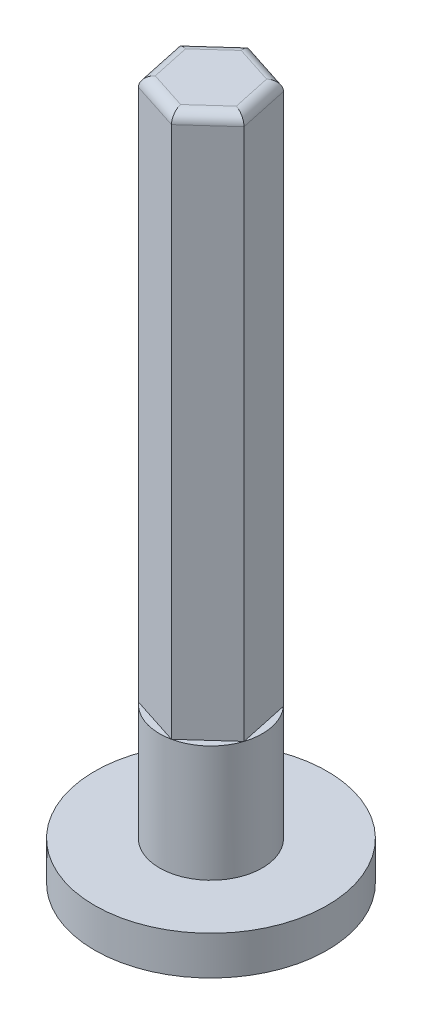
ISO-10303-21;
HEADER;
FILE_DESCRIPTION(('STEP AP214'),'2;1');
FILE_NAME('part.step','',(''),(''),'','','');
FILE_SCHEMA(('AUTOMOTIVE_DESIGN { 1 0 10303 214 1 1 1 1 }'));
ENDSEC;
DATA;
#1=APPLICATION_CONTEXT('core data for automotive mechanical design processes');
#2=APPLICATION_PROTOCOL_DEFINITION('international standard','automotive_design',2000,#1);
#3=PRODUCT_CONTEXT('',#1,'mechanical');
#4=PRODUCT('Part','Part','',(#3));
#5=PRODUCT_RELATED_PRODUCT_CATEGORY('part','',(#4));
#6=PRODUCT_DEFINITION_FORMATION('','',#4);
#7=PRODUCT_DEFINITION_CONTEXT('part definition',#1,'design');
#8=PRODUCT_DEFINITION('design','',#6,#7);
#9=PRODUCT_DEFINITION_SHAPE('','',#8);
#10=(LENGTH_UNIT() NAMED_UNIT(*) SI_UNIT(.MILLI.,.METRE.));
#11=(NAMED_UNIT(*) PLANE_ANGLE_UNIT() SI_UNIT($,.RADIAN.));
#12=(NAMED_UNIT(*) SI_UNIT($,.STERADIAN.) SOLID_ANGLE_UNIT());
#13=UNCERTAINTY_MEASURE_WITH_UNIT(LENGTH_MEASURE(1.E-05),#10,'distance_accuracy_value','');
#14=(GEOMETRIC_REPRESENTATION_CONTEXT(3) GLOBAL_UNCERTAINTY_ASSIGNED_CONTEXT((#13)) GLOBAL_UNIT_ASSIGNED_CONTEXT((#10,
#11,#12)) REPRESENTATION_CONTEXT('',''));
#15=CARTESIAN_POINT('',(0.,0.,0.));
#16=DIRECTION('',(0.,0.,1.));
#17=DIRECTION('',(1.,0.,0.));
#18=AXIS2_PLACEMENT_3D('',#15,#16,#17);
#19=CARTESIAN_POINT('',(0.,12.,0.));
#20=DIRECTION('',(0.,1.,0.));
#21=DIRECTION('',(0.,0.,1.));
#22=AXIS2_PLACEMENT_3D('',#19,#20,#21);
#23=PLANE('',#22);
#24=DIRECTION('',(0.951551323955086,0.,0.307489963867642));
#25=VECTOR('',#24,1.);
#26=CARTESIAN_POINT('',(-1.05851912746959,12.,3.27566878771054));
#27=LINE('',#26,#25);
#28=CARTESIAN_POINT('',(-2.94972738383033,12.,2.6645324845236));
#29=VERTEX_POINT('',#28);
#30=CARTESIAN_POINT('',(0.832689128891137,12.,3.88680509089747));
#31=VERTEX_POINT('',#30);
#32=EDGE_CURVE('E149',#29,#31,#27,.T.);
#33=ORIENTED_EDGE('',*,*,#32,.F.);
#34=CARTESIAN_POINT('',(0.,12.,0.));
#35=DIRECTION('',(0.,1.,0.));
#36=DIRECTION('',(0.,0.,1.));
#37=AXIS2_PLACEMENT_3D('',#34,#35,#36);
#38=CIRCLE('',#37,3.975);
#39=EDGE_CURVE('E136',#29,#31,#38,.T.);
#40=ORIENTED_EDGE('',*,*,#39,.T.);
#41=EDGE_LOOP('',(#33,#40));
#42=FACE_BOUND('',#41,.T.);
#43=ADVANCED_FACE('F36',(#42),#23,.T.);
#44=DIRECTION('',(0.209481541859406,0.,0.977812601483641));
#45=VECTOR('',#44,1.);
#46=CARTESIAN_POINT('',(-3.3660719482759,12.,0.721129939074861));
#47=LINE('',#46,#45);
#48=CARTESIAN_POINT('',(-3.78241651272147,12.,-1.22227260637388));
#49=VERTEX_POINT('',#48);
#50=EDGE_CURVE('E158',#49,#29,#47,.T.);
#51=ORIENTED_EDGE('',*,*,#50,.F.);
#52=EDGE_CURVE('E233',#49,#29,#38,.T.);
#53=ORIENTED_EDGE('',*,*,#52,.T.);
#54=EDGE_LOOP('',(#51,#53));
#55=FACE_BOUND('',#54,.T.);
#56=ADVANCED_FACE('F243',(#55),#23,.T.);
#57=DIRECTION('',(-0.74206978209568,0.,0.670322637615999));
#58=VECTOR('',#57,1.);
#59=CARTESIAN_POINT('',(-2.3075528208063,12.,-2.55453884863568));
#60=LINE('',#59,#58);
#61=CARTESIAN_POINT('',(-0.832689128891139,12.,-3.88680509089747));
#62=VERTEX_POINT('',#61);
#63=EDGE_CURVE('E155',#62,#49,#60,.T.);
#64=ORIENTED_EDGE('',*,*,#63,.F.);
#65=EDGE_CURVE('E231',#62,#49,#38,.T.);
#66=ORIENTED_EDGE('',*,*,#65,.T.);
#67=EDGE_LOOP('',(#64,#66));
#68=FACE_BOUND('',#67,.T.);
#69=ADVANCED_FACE('F245',(#68),#23,.T.);
#70=DIRECTION('',(-0.951551323955086,0.,-0.307489963867642));
#71=VECTOR('',#70,1.);
#72=CARTESIAN_POINT('',(1.05851912746959,12.,-3.27566878771054));
#73=LINE('',#72,#71);
#74=CARTESIAN_POINT('',(2.94972738383033,12.,-2.6645324845236));
#75=VERTEX_POINT('',#74);
#76=EDGE_CURVE('E146',#75,#62,#73,.T.);
#77=ORIENTED_EDGE('',*,*,#76,.F.);
#78=EDGE_CURVE('E143',#75,#62,#38,.T.);
#79=ORIENTED_EDGE('',*,*,#78,.T.);
#80=EDGE_LOOP('',(#77,#79));
#81=FACE_BOUND('',#80,.T.);
#82=ADVANCED_FACE('F230',(#81),#23,.T.);
#83=DIRECTION('',(-0.209481541859406,0.,-0.977812601483641));
#84=VECTOR('',#83,1.);
#85=CARTESIAN_POINT('',(3.3660719482759,12.,-0.721129939074861));
#86=LINE('',#85,#84);
#87=CARTESIAN_POINT('',(3.78241651272147,12.,1.22227260637388));
#88=VERTEX_POINT('',#87);
#89=EDGE_CURVE('E112',#88,#75,#86,.T.);
#90=ORIENTED_EDGE('',*,*,#89,.F.);
#91=EDGE_CURVE('E134',#88,#75,#38,.T.);
#92=ORIENTED_EDGE('',*,*,#91,.T.);
#93=EDGE_LOOP('',(#90,#92));
#94=FACE_BOUND('',#93,.T.);
#95=ADVANCED_FACE('F145',(#94),#23,.T.);
#96=CARTESIAN_POINT('',(0.,3.,0.));
#97=DIRECTION('',(0.,-1.,0.));
#98=DIRECTION('',(0.,0.,-1.));
#99=AXIS2_PLACEMENT_3D('',#96,#97,#98);
#100=CYLINDRICAL_SURFACE('',#99,9.);
#101=CARTESIAN_POINT('',(0.,3.,0.));
#102=DIRECTION('',(0.,1.,0.));
#103=DIRECTION('',(0.,0.,1.));
#104=AXIS2_PLACEMENT_3D('',#101,#102,#103);
#105=CIRCLE('',#104,9.);
#106=CARTESIAN_POINT('',(0.,3.,9.));
#107=VERTEX_POINT('',#106);
#108=EDGE_CURVE('E173',#107,#107,#105,.T.);
#109=ORIENTED_EDGE('',*,*,#108,.F.);
#110=EDGE_LOOP('',(#109));
#111=FACE_BOUND('',#110,.T.);
#112=CARTESIAN_POINT('',(0.,0.,0.));
#113=DIRECTION('',(0.,1.,0.));
#114=DIRECTION('',(0.,0.,1.));
#115=AXIS2_PLACEMENT_3D('',#112,#113,#114);
#116=CIRCLE('',#115,9.);
#117=CARTESIAN_POINT('',(0.,0.,9.));
#118=VERTEX_POINT('',#117);
#119=EDGE_CURVE('E133',#118,#118,#116,.T.);
#120=ORIENTED_EDGE('',*,*,#119,.T.);
#121=EDGE_LOOP('',(#120));
#122=FACE_BOUND('',#121,.T.);
#123=ADVANCED_FACE('F261',(#111,#122),#100,.T.);
#124=CARTESIAN_POINT('',(0.,3.,0.));
#125=DIRECTION('',(0.,1.,0.));
#126=DIRECTION('',(0.,0.,1.));
#127=AXIS2_PLACEMENT_3D('',#124,#125,#126);
#128=PLANE('',#127);
#129=CARTESIAN_POINT('',(0.,3.,0.));
#130=DIRECTION('',(0.,1.,0.));
#131=DIRECTION('',(0.,0.,1.));
#132=AXIS2_PLACEMENT_3D('',#129,#130,#131);
#133=CIRCLE('',#132,3.975);
#134=CARTESIAN_POINT('',(0.,3.,3.975));
#135=VERTEX_POINT('',#134);
#136=EDGE_CURVE('E169',#135,#135,#133,.T.);
#137=ORIENTED_EDGE('',*,*,#136,.F.);
#138=EDGE_LOOP('',(#137));
#139=FACE_BOUND('',#138,.T.);
#140=ORIENTED_EDGE('',*,*,#108,.T.);
#141=EDGE_LOOP('',(#140));
#142=FACE_BOUND('',#141,.T.);
#143=ADVANCED_FACE('F258',(#139,#142),#128,.T.);
#144=CARTESIAN_POINT('',(0.,0.,0.));
#145=DIRECTION('',(0.,1.,0.));
#146=DIRECTION('',(0.,0.,1.));
#147=AXIS2_PLACEMENT_3D('',#144,#145,#146);
#148=PLANE('',#147);
#149=ORIENTED_EDGE('',*,*,#119,.F.);
#150=EDGE_LOOP('',(#149));
#151=FACE_BOUND('',#150,.T.);
#152=ADVANCED_FACE('F257',(#151),#148,.F.);
#153=CARTESIAN_POINT('',(0.,12.,0.));
#154=DIRECTION('',(0.,-1.,0.));
#155=DIRECTION('',(0.,0.,-1.));
#156=AXIS2_PLACEMENT_3D('',#153,#154,#155);
#157=CYLINDRICAL_SURFACE('',#156,3.975);
#158=EDGE_CURVE('E125',#31,#88,#38,.T.);
#159=ORIENTED_EDGE('',*,*,#158,.F.);
#160=ORIENTED_EDGE('',*,*,#39,.F.);
#161=ORIENTED_EDGE('',*,*,#52,.F.);
#162=ORIENTED_EDGE('',*,*,#65,.F.);
#163=ORIENTED_EDGE('',*,*,#78,.F.);
#164=ORIENTED_EDGE('',*,*,#91,.F.);
#165=EDGE_LOOP('',(#159,#160,#161,#162,#163,#164));
#166=FACE_BOUND('',#165,.T.);
#167=ORIENTED_EDGE('',*,*,#136,.T.);
#168=EDGE_LOOP('',(#167));
#169=FACE_BOUND('',#168,.T.);
#170=ADVANCED_FACE('F139',(#166,#169),#157,.T.);
#171=DIRECTION('',(0.74206978209568,0.,-0.670322637615999));
#172=VECTOR('',#171,1.);
#173=CARTESIAN_POINT('',(2.3075528208063,12.,2.55453884863567));
#174=LINE('',#173,#172);
#175=EDGE_CURVE('E128',#31,#88,#174,.T.);
#176=ORIENTED_EDGE('',*,*,#175,.F.);
#177=ORIENTED_EDGE('',*,*,#158,.T.);
#178=EDGE_LOOP('',(#176,#177));
#179=FACE_BOUND('',#178,.T.);
#180=ADVANCED_FACE('F127',(#179),#23,.T.);
#181=CARTESIAN_POINT('',(-1.05851912746959,54.,3.27566878771054));
#182=DIRECTION('',(0.307489963867642,0.,-0.951551323955086));
#183=DIRECTION('',(-0.951551323955086,0.,-0.307489963867642));
#184=AXIS2_PLACEMENT_3D('',#181,#182,#183);
#185=PLANE('',#184);
#186=DIRECTION('',(0.,-1.,0.));
#187=VECTOR('',#186,1.);
#188=CARTESIAN_POINT('',(0.83268912889114,54.,3.88680509089747));
#189=LINE('',#188,#187);
#190=CARTESIAN_POINT('',(0.83268912889114,53.2,3.88680509089747));
#191=VERTEX_POINT('',#190);
#192=EDGE_CURVE('E119',#191,#31,#189,.T.);
#193=ORIENTED_EDGE('',*,*,#192,.F.);
#194=DIRECTION('',(0.951551323955086,0.,0.307489963867642));
#195=VECTOR('',#194,1.);
#196=CARTESIAN_POINT('',(-2.94972738383033,53.2,2.6645324845236));
#197=LINE('',#196,#195);
#198=CARTESIAN_POINT('',(-2.94972738383033,53.2,2.6645324845236));
#199=VERTEX_POINT('',#198);
#200=EDGE_CURVE('E11',#191,#199,#197,.F.);
#201=ORIENTED_EDGE('',*,*,#200,.T.);
#202=DIRECTION('',(0.,-1.,0.));
#203=VECTOR('',#202,1.);
#204=CARTESIAN_POINT('',(-2.94972738383033,54.,2.6645324845236));
#205=LINE('',#204,#203);
#206=EDGE_CURVE('E161',#199,#29,#205,.T.);
#207=ORIENTED_EDGE('',*,*,#206,.T.);
#208=ORIENTED_EDGE('',*,*,#32,.T.);
#209=EDGE_LOOP('',(#193,#201,#207,#208));
#210=FACE_BOUND('',#209,.T.);
#211=ADVANCED_FACE('F241',(#210),#185,.F.);
#212=CARTESIAN_POINT('',(2.3075528208063,54.,2.55453884863567));
#213=DIRECTION('',(-0.670322637615999,0.,-0.74206978209568));
#214=DIRECTION('',(-0.74206978209568,0.,0.670322637615999));
#215=AXIS2_PLACEMENT_3D('',#212,#213,#214);
#216=PLANE('',#215);
#217=DIRECTION('',(0.,-1.,0.));
#218=VECTOR('',#217,1.);
#219=CARTESIAN_POINT('',(3.78241651272147,54.,1.22227260637388));
#220=LINE('',#219,#218);
#221=CARTESIAN_POINT('',(3.78241651272147,53.2,1.22227260637388));
#222=VERTEX_POINT('',#221);
#223=EDGE_CURVE('E107',#222,#88,#220,.T.);
#224=ORIENTED_EDGE('',*,*,#223,.F.);
#225=DIRECTION('',(0.74206978209568,0.,-0.670322637615999));
#226=VECTOR('',#225,1.);
#227=CARTESIAN_POINT('',(0.832689128891139,53.2,3.88680509089747));
#228=LINE('',#227,#226);
#229=EDGE_CURVE('E190',#222,#191,#228,.F.);
#230=ORIENTED_EDGE('',*,*,#229,.T.);
#231=ORIENTED_EDGE('',*,*,#192,.T.);
#232=ORIENTED_EDGE('',*,*,#175,.T.);
#233=EDGE_LOOP('',(#224,#230,#231,#232));
#234=FACE_BOUND('',#233,.T.);
#235=ADVANCED_FACE('F148',(#234),#216,.F.);
#236=CARTESIAN_POINT('',(3.3660719482759,54.,-0.721129939074861));
#237=DIRECTION('',(-0.977812601483641,0.,0.209481541859406));
#238=DIRECTION('',(0.209481541859406,0.,0.977812601483641));
#239=AXIS2_PLACEMENT_3D('',#236,#237,#238);
#240=PLANE('',#239);
#241=DIRECTION('',(0.,-1.,0.));
#242=VECTOR('',#241,1.);
#243=CARTESIAN_POINT('',(2.94972738383033,54.,-2.6645324845236));
#244=LINE('',#243,#242);
#245=CARTESIAN_POINT('',(2.94972738383033,53.2,-2.6645324845236));
#246=VERTEX_POINT('',#245);
#247=EDGE_CURVE('E120',#246,#75,#244,.T.);
#248=ORIENTED_EDGE('',*,*,#247,.F.);
#249=DIRECTION('',(-0.209481541859406,0.,-0.977812601483641));
#250=VECTOR('',#249,1.);
#251=CARTESIAN_POINT('',(3.78241651272147,53.2,1.22227260637388));
#252=LINE('',#251,#250);
#253=EDGE_CURVE('E114',#246,#222,#252,.F.);
#254=ORIENTED_EDGE('',*,*,#253,.T.);
#255=ORIENTED_EDGE('',*,*,#223,.T.);
#256=ORIENTED_EDGE('',*,*,#89,.T.);
#257=EDGE_LOOP('',(#248,#254,#255,#256));
#258=FACE_BOUND('',#257,.T.);
#259=ADVANCED_FACE('F110',(#258),#240,.F.);
#260=CARTESIAN_POINT('',(1.05851912746959,54.,-3.27566878771054));
#261=DIRECTION('',(-0.307489963867642,0.,0.951551323955086));
#262=DIRECTION('',(0.951551323955086,0.,0.307489963867642));
#263=AXIS2_PLACEMENT_3D('',#260,#261,#262);
#264=PLANE('',#263);
#265=DIRECTION('',(0.,-1.,0.));
#266=VECTOR('',#265,1.);
#267=CARTESIAN_POINT('',(-0.832689128891139,54.,-3.88680509089747));
#268=LINE('',#267,#266);
#269=CARTESIAN_POINT('',(-0.832689128891139,53.2,-3.88680509089747));
#270=VERTEX_POINT('',#269);
#271=EDGE_CURVE('E165',#270,#62,#268,.T.);
#272=ORIENTED_EDGE('',*,*,#271,.F.);
#273=DIRECTION('',(-0.951551323955086,0.,-0.307489963867642));
#274=VECTOR('',#273,1.);
#275=CARTESIAN_POINT('',(2.94972738383033,53.2,-2.6645324845236));
#276=LINE('',#275,#274);
#277=EDGE_CURVE('E193',#270,#246,#276,.F.);
#278=ORIENTED_EDGE('',*,*,#277,.T.);
#279=ORIENTED_EDGE('',*,*,#247,.T.);
#280=ORIENTED_EDGE('',*,*,#76,.T.);
#281=EDGE_LOOP('',(#272,#278,#279,#280));
#282=FACE_BOUND('',#281,.T.);
#283=ADVANCED_FACE('F227',(#282),#264,.F.);
#284=CARTESIAN_POINT('',(-2.3075528208063,54.,-2.55453884863568));
#285=DIRECTION('',(0.670322637615999,0.,0.74206978209568));
#286=DIRECTION('',(0.74206978209568,0.,-0.670322637615999));
#287=AXIS2_PLACEMENT_3D('',#284,#285,#286);
#288=PLANE('',#287);
#289=DIRECTION('',(0.,-1.,0.));
#290=VECTOR('',#289,1.);
#291=CARTESIAN_POINT('',(-3.78241651272147,54.,-1.22227260637388));
#292=LINE('',#291,#290);
#293=CARTESIAN_POINT('',(-3.78241651272147,53.2,-1.22227260637388));
#294=VERTEX_POINT('',#293);
#295=EDGE_CURVE('E163',#294,#49,#292,.T.);
#296=ORIENTED_EDGE('',*,*,#295,.F.);
#297=DIRECTION('',(-0.74206978209568,0.,0.670322637615999));
#298=VECTOR('',#297,1.);
#299=CARTESIAN_POINT('',(-0.832689128891139,53.2,-3.88680509089747));
#300=LINE('',#299,#298);
#301=EDGE_CURVE('E195',#294,#270,#300,.F.);
#302=ORIENTED_EDGE('',*,*,#301,.T.);
#303=ORIENTED_EDGE('',*,*,#271,.T.);
#304=ORIENTED_EDGE('',*,*,#63,.T.);
#305=EDGE_LOOP('',(#296,#302,#303,#304));
#306=FACE_BOUND('',#305,.T.);
#307=ADVANCED_FACE('F224',(#306),#288,.F.);
#308=CARTESIAN_POINT('',(-3.3660719482759,54.,0.721129939074861));
#309=DIRECTION('',(0.977812601483641,0.,-0.209481541859406));
#310=DIRECTION('',(-0.209481541859406,0.,-0.977812601483641));
#311=AXIS2_PLACEMENT_3D('',#308,#309,#310);
#312=PLANE('',#311);
#313=ORIENTED_EDGE('',*,*,#206,.F.);
#314=DIRECTION('',(0.209481541859406,0.,0.977812601483641));
#315=VECTOR('',#314,1.);
#316=CARTESIAN_POINT('',(-3.78241651272147,53.2,-1.22227260637388));
#317=LINE('',#316,#315);
#318=EDGE_CURVE('E45',#199,#294,#317,.F.);
#319=ORIENTED_EDGE('',*,*,#318,.T.);
#320=ORIENTED_EDGE('',*,*,#295,.T.);
#321=ORIENTED_EDGE('',*,*,#50,.T.);
#322=EDGE_LOOP('',(#313,#319,#320,#321));
#323=FACE_BOUND('',#322,.T.);
#324=ADVANCED_FACE('F242',(#323),#312,.F.);
#325=CARTESIAN_POINT('',(0.,54.,0.));
#326=DIRECTION('',(0.,1.,0.));
#327=DIRECTION('',(0.,0.,1.));
#328=AXIS2_PLACEMENT_3D('',#325,#326,#327);
#329=PLANE('',#328);
#330=DIRECTION('',(0.951551323955086,0.,0.307489963867642));
#331=VECTOR('',#330,1.);
#332=CARTESIAN_POINT('',(1.07868109998525,54.,3.12556403173341));
#333=LINE('',#332,#331);
#334=CARTESIAN_POINT('',(-2.26423268230964,54.,2.0453149560892));
#335=VERTEX_POINT('',#334);
#336=CARTESIAN_POINT('',(0.639178369558681,54.,2.98354050100373));
#337=VERTEX_POINT('',#336);
#338=EDGE_CURVE('E172',#335,#337,#333,.T.);
#339=ORIENTED_EDGE('',*,*,#338,.T.);
#340=DIRECTION('',(0.74206978209568,0.,-0.670322637615999));
#341=VECTOR('',#340,1.);
#342=CARTESIAN_POINT('',(3.24615840262867,54.,0.628616780697331));
#343=LINE('',#342,#341);
#344=CARTESIAN_POINT('',(2.90341105186832,54.,0.938225544914529));
#345=VERTEX_POINT('',#344);
#346=EDGE_CURVE('E187',#337,#345,#343,.T.);
#347=ORIENTED_EDGE('',*,*,#346,.T.);
#348=DIRECTION('',(-0.209481541859406,0.,-0.977812601483641));
#349=VECTOR('',#348,1.);
#350=CARTESIAN_POINT('',(2.16747730264341,54.,-2.49694725103607));
#351=LINE('',#350,#349);
#352=CARTESIAN_POINT('',(2.26423268230964,54.,-2.0453149560892));
#353=VERTEX_POINT('',#352);
#354=EDGE_CURVE('E185',#345,#353,#351,.T.);
#355=ORIENTED_EDGE('',*,*,#354,.T.);
#356=DIRECTION('',(-0.951551323955086,0.,-0.307489963867642));
#357=VECTOR('',#356,1.);
#358=CARTESIAN_POINT('',(-1.07868109998525,54.,-3.12556403173341));
#359=LINE('',#358,#357);
#360=CARTESIAN_POINT('',(-0.639178369558682,54.,-2.98354050100373));
#361=VERTEX_POINT('',#360);
#362=EDGE_CURVE('E183',#353,#361,#359,.T.);
#363=ORIENTED_EDGE('',*,*,#362,.T.);
#364=DIRECTION('',(-0.74206978209568,0.,0.670322637615999));
#365=VECTOR('',#364,1.);
#366=CARTESIAN_POINT('',(-3.24615840262867,54.,-0.628616780697333));
#367=LINE('',#366,#365);
#368=CARTESIAN_POINT('',(-2.90341105186832,54.,-0.938225544914531));
#369=VERTEX_POINT('',#368);
#370=EDGE_CURVE('E181',#361,#369,#367,.T.);
#371=ORIENTED_EDGE('',*,*,#370,.T.);
#372=DIRECTION('',(0.209481541859406,0.,0.977812601483641));
#373=VECTOR('',#372,1.);
#374=CARTESIAN_POINT('',(-2.16747730264341,54.,2.49694725103607));
#375=LINE('',#374,#373);
#376=EDGE_CURVE('E179',#369,#335,#375,.T.);
#377=ORIENTED_EDGE('',*,*,#376,.T.);
#378=EDGE_LOOP('',(#339,#347,#355,#363,#371,#377));
#379=FACE_BOUND('',#378,.T.);
#380=ADVANCED_FACE('F287',(#379),#329,.T.);
#381=CARTESIAN_POINT('',(-1.7712947107135,53.2,-1.96088302295913));
#382=DIRECTION('',(0.74206978209568,0.,-0.670322637615999));
#383=DIRECTION('',(-0.670322637615999,0.,-0.74206978209568));
#384=AXIS2_PLACEMENT_3D('',#381,#382,#383);
#385=CYLINDRICAL_SURFACE('',#384,0.8);
#386=CARTESIAN_POINT('',(-0.639178369558682,53.2,-2.98354050100373));
#387=DIRECTION('',(0.977812601483641,0.,-0.209481541859406));
#388=DIRECTION('',(-0.209481541859406,0.,-0.977812601483641));
#389=AXIS2_PLACEMENT_3D('',#386,#387,#388);
#390=ELLIPSE('',#389,0.923760430703401,0.8);
#391=EDGE_CURVE('E207',#270,#361,#390,.T.);
#392=ORIENTED_EDGE('',*,*,#391,.F.);
#393=ORIENTED_EDGE('',*,*,#301,.F.);
#394=CARTESIAN_POINT('',(-2.90341105186832,53.2,-0.938225544914531));
#395=DIRECTION('',(0.307489963867642,0.,-0.951551323955086));
#396=DIRECTION('',(-0.951551323955086,0.,-0.307489963867642));
#397=AXIS2_PLACEMENT_3D('',#394,#395,#396);
#398=ELLIPSE('',#397,0.923760430703401,0.8);
#399=EDGE_CURVE('E40',#369,#294,#398,.F.);
#400=ORIENTED_EDGE('',*,*,#399,.F.);
#401=ORIENTED_EDGE('',*,*,#370,.F.);
#402=EDGE_LOOP('',(#392,#393,#400,#401));
#403=FACE_BOUND('',#402,.T.);
#404=ADVANCED_FACE('F38',(#403),#385,.T.);
#405=CARTESIAN_POINT('',(-2.58382186708898,53.2,0.553544705587336));
#406=DIRECTION('',(-0.209481541859406,0.,-0.977812601483641));
#407=DIRECTION('',(-0.977812601483641,0.,0.209481541859406));
#408=AXIS2_PLACEMENT_3D('',#405,#406,#407);
#409=CYLINDRICAL_SURFACE('',#408,0.8);
#410=ORIENTED_EDGE('',*,*,#399,.T.);
#411=ORIENTED_EDGE('',*,*,#318,.F.);
#412=CARTESIAN_POINT('',(-2.26423268230964,53.2,2.0453149560892));
#413=DIRECTION('',(-0.670322637616,0.,-0.74206978209568));
#414=DIRECTION('',(-0.74206978209568,0.,0.670322637615999));
#415=AXIS2_PLACEMENT_3D('',#412,#413,#414);
#416=ELLIPSE('',#415,0.923760430703401,0.8);
#417=EDGE_CURVE('E205',#335,#199,#416,.F.);
#418=ORIENTED_EDGE('',*,*,#417,.F.);
#419=ORIENTED_EDGE('',*,*,#376,.F.);
#420=EDGE_LOOP('',(#410,#411,#418,#419));
#421=FACE_BOUND('',#420,.T.);
#422=ADVANCED_FACE('F217',(#421),#409,.T.);
#423=CARTESIAN_POINT('',(0.812527156375481,53.2,-2.51442772854647));
#424=DIRECTION('',(0.951551323955086,0.,0.307489963867642));
#425=DIRECTION('',(0.307489963867642,0.,-0.951551323955086));
#426=AXIS2_PLACEMENT_3D('',#423,#424,#425);
#427=CYLINDRICAL_SURFACE('',#426,0.8);
#428=ORIENTED_EDGE('',*,*,#391,.T.);
#429=ORIENTED_EDGE('',*,*,#362,.F.);
#430=CARTESIAN_POINT('',(2.26423268230964,53.2,-2.0453149560892));
#431=DIRECTION('',(0.670322637616,0.,0.74206978209568));
#432=DIRECTION('',(0.74206978209568,0.,-0.670322637615999));
#433=AXIS2_PLACEMENT_3D('',#430,#431,#432);
#434=ELLIPSE('',#433,0.923760430703401,0.8);
#435=EDGE_CURVE('E202',#246,#353,#434,.T.);
#436=ORIENTED_EDGE('',*,*,#435,.F.);
#437=ORIENTED_EDGE('',*,*,#277,.F.);
#438=EDGE_LOOP('',(#428,#429,#436,#437));
#439=FACE_BOUND('',#438,.T.);
#440=ADVANCED_FACE('F280',(#439),#427,.T.);
#441=CARTESIAN_POINT('',(-0.81252715637548,53.2,2.51442772854647));
#442=DIRECTION('',(-0.951551323955086,0.,-0.307489963867642));
#443=DIRECTION('',(-0.307489963867642,0.,0.951551323955086));
#444=AXIS2_PLACEMENT_3D('',#441,#442,#443);
#445=CYLINDRICAL_SURFACE('',#444,0.8);
#446=ORIENTED_EDGE('',*,*,#417,.T.);
#447=ORIENTED_EDGE('',*,*,#200,.F.);
#448=CARTESIAN_POINT('',(0.639178369558681,53.2,2.98354050100373));
#449=DIRECTION('',(-0.977812601483641,0.,0.209481541859406));
#450=DIRECTION('',(-0.209481541859406,0.,-0.977812601483641));
#451=AXIS2_PLACEMENT_3D('',#448,#449,#450);
#452=ELLIPSE('',#451,0.923760430703401,0.8);
#453=EDGE_CURVE('E200',#337,#191,#452,.F.);
#454=ORIENTED_EDGE('',*,*,#453,.F.);
#455=ORIENTED_EDGE('',*,*,#338,.F.);
#456=EDGE_LOOP('',(#446,#447,#454,#455));
#457=FACE_BOUND('',#456,.T.);
#458=ADVANCED_FACE('F276',(#457),#445,.T.);
#459=CARTESIAN_POINT('',(2.58382186708898,53.2,-0.553544705587336));
#460=DIRECTION('',(0.209481541859406,0.,0.977812601483641));
#461=DIRECTION('',(0.977812601483641,0.,-0.209481541859406));
#462=AXIS2_PLACEMENT_3D('',#459,#460,#461);
#463=CYLINDRICAL_SURFACE('',#462,0.8);
#464=ORIENTED_EDGE('',*,*,#435,.T.);
#465=ORIENTED_EDGE('',*,*,#354,.F.);
#466=CARTESIAN_POINT('',(2.90341105186832,53.2,0.938225544914529));
#467=DIRECTION('',(-0.307489963867642,0.,0.951551323955086));
#468=DIRECTION('',(0.951551323955086,0.,0.307489963867642));
#469=AXIS2_PLACEMENT_3D('',#466,#467,#468);
#470=ELLIPSE('',#469,0.923760430703401,0.8);
#471=EDGE_CURVE('E198',#222,#345,#470,.T.);
#472=ORIENTED_EDGE('',*,*,#471,.F.);
#473=ORIENTED_EDGE('',*,*,#253,.F.);
#474=EDGE_LOOP('',(#464,#465,#472,#473));
#475=FACE_BOUND('',#474,.T.);
#476=ADVANCED_FACE('F272',(#475),#463,.T.);
#477=CARTESIAN_POINT('',(1.7712947107135,53.2,1.96088302295913));
#478=DIRECTION('',(-0.74206978209568,0.,0.670322637615999));
#479=DIRECTION('',(0.670322637615999,0.,0.74206978209568));
#480=AXIS2_PLACEMENT_3D('',#477,#478,#479);
#481=CYLINDRICAL_SURFACE('',#480,0.8);
#482=ORIENTED_EDGE('',*,*,#453,.T.);
#483=ORIENTED_EDGE('',*,*,#229,.F.);
#484=ORIENTED_EDGE('',*,*,#471,.T.);
#485=ORIENTED_EDGE('',*,*,#346,.F.);
#486=EDGE_LOOP('',(#482,#483,#484,#485));
#487=FACE_BOUND('',#486,.T.);
#488=ADVANCED_FACE('F269',(#487),#481,.T.);
#489=CLOSED_SHELL('',(#43,#56,#69,#82,#95,#123,#143,#152,#170,#180,#211,#235,#259,#283,#307,
#324,#380,#404,#422,#440,#458,#476,#488));
#490=MANIFOLD_SOLID_BREP('B2',#489);
#491=ADVANCED_BREP_SHAPE_REPRESENTATION('',(#18,#490),#14);
#492=SHAPE_DEFINITION_REPRESENTATION(#9,#491);
ENDSEC;
END-ISO-10303-21;
